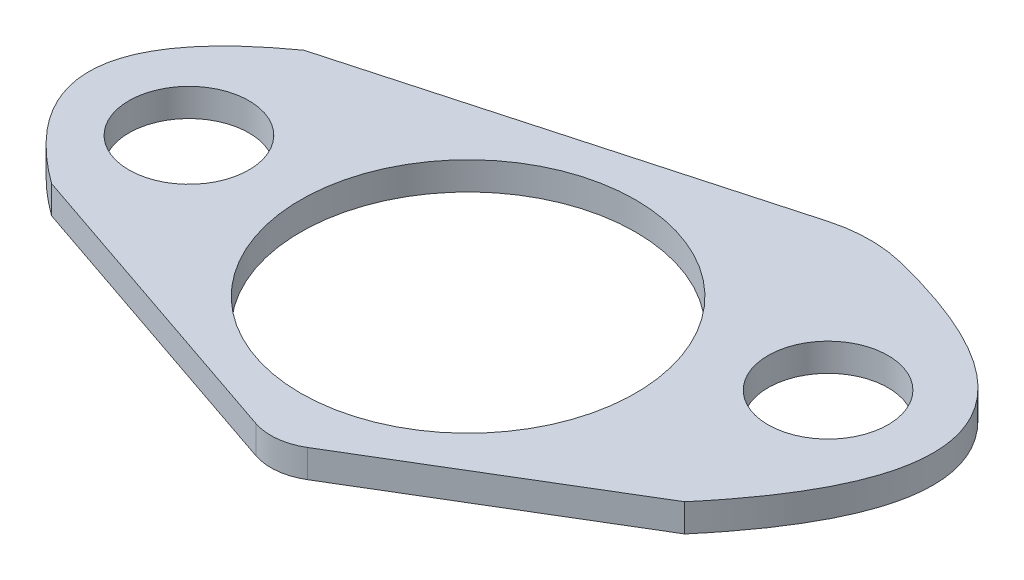
ISO-10303-21;
HEADER;
FILE_DESCRIPTION(('STEP AP214'),'2;1');
FILE_NAME('part.step','',(''),(''),'','','');
FILE_SCHEMA(('AUTOMOTIVE_DESIGN { 1 0 10303 214 1 1 1 1 }'));
ENDSEC;
DATA;
#1=APPLICATION_CONTEXT('core data for automotive mechanical design processes');
#2=APPLICATION_PROTOCOL_DEFINITION('international standard','automotive_design',2000,#1);
#3=PRODUCT_CONTEXT('',#1,'mechanical');
#4=PRODUCT('Part','Part','',(#3));
#5=PRODUCT_RELATED_PRODUCT_CATEGORY('part','',(#4));
#6=PRODUCT_DEFINITION_FORMATION('','',#4);
#7=PRODUCT_DEFINITION_CONTEXT('part definition',#1,'design');
#8=PRODUCT_DEFINITION('design','',#6,#7);
#9=PRODUCT_DEFINITION_SHAPE('','',#8);
#10=(LENGTH_UNIT() NAMED_UNIT(*) SI_UNIT(.MILLI.,.METRE.));
#11=(NAMED_UNIT(*) PLANE_ANGLE_UNIT() SI_UNIT($,.RADIAN.));
#12=(NAMED_UNIT(*) SI_UNIT($,.STERADIAN.) SOLID_ANGLE_UNIT());
#13=UNCERTAINTY_MEASURE_WITH_UNIT(LENGTH_MEASURE(1.E-05),#10,'distance_accuracy_value','');
#14=(GEOMETRIC_REPRESENTATION_CONTEXT(3) GLOBAL_UNCERTAINTY_ASSIGNED_CONTEXT((#13)) GLOBAL_UNIT_ASSIGNED_CONTEXT((#10,
#11,#12)) REPRESENTATION_CONTEXT('',''));
#15=CARTESIAN_POINT('',(0.,0.,0.));
#16=DIRECTION('',(0.,0.,1.));
#17=DIRECTION('',(1.,0.,0.));
#18=AXIS2_PLACEMENT_3D('',#15,#16,#17);
#19=CARTESIAN_POINT('',(5.45038988415731,0.,-3.95758579465904));
#20=DIRECTION('',(0.,-1.,0.));
#21=DIRECTION('',(0.,0.,-1.));
#22=AXIS2_PLACEMENT_3D('',#19,#20,#21);
#23=CYLINDRICAL_SURFACE('',#22,5.);
#24=DIRECTION('',(0.,-1.,0.));
#25=VECTOR('',#24,1.);
#26=CARTESIAN_POINT('',(6.64109145170587,0.,-8.81373959957888));
#27=LINE('',#26,#25);
#28=CARTESIAN_POINT('',(6.64109145170586,0.,-8.81373959957888));
#29=VERTEX_POINT('',#28);
#30=CARTESIAN_POINT('',(6.64109145170587,1.,-8.81373959957888));
#31=VERTEX_POINT('',#30);
#32=EDGE_CURVE('E146',#29,#31,#27,.F.);
#33=ORIENTED_EDGE('',*,*,#32,.F.);
#34=CARTESIAN_POINT('',(5.45038988415731,0.,-3.95758579465904));
#35=DIRECTION('',(0.,-1.,0.));
#36=DIRECTION('',(0.,0.,-1.));
#37=AXIS2_PLACEMENT_3D('',#34,#35,#36);
#38=CIRCLE('',#37,5.);
#39=CARTESIAN_POINT('',(4.1138367117806,0.,-8.77563785097908));
#40=VERTEX_POINT('',#39);
#41=EDGE_CURVE('E51',#40,#29,#38,.T.);
#42=ORIENTED_EDGE('',*,*,#41,.F.);
#43=DIRECTION('',(0.,-1.,0.));
#44=VECTOR('',#43,1.);
#45=CARTESIAN_POINT('',(4.11383671178059,1.,-8.77563785097908));
#46=LINE('',#45,#44);
#47=CARTESIAN_POINT('',(4.1138367117806,1.,-8.77563785097908));
#48=VERTEX_POINT('',#47);
#49=EDGE_CURVE('E150',#48,#40,#46,.T.);
#50=ORIENTED_EDGE('',*,*,#49,.F.);
#51=CARTESIAN_POINT('',(5.45038988415731,1.,-3.95758579465904));
#52=DIRECTION('',(0.,-1.,0.));
#53=DIRECTION('',(0.,0.,-1.));
#54=AXIS2_PLACEMENT_3D('',#51,#52,#53);
#55=CIRCLE('',#54,5.);
#56=EDGE_CURVE('E11',#31,#48,#55,.F.);
#57=ORIENTED_EDGE('',*,*,#56,.F.);
#58=EDGE_LOOP('',(#33,#42,#50,#57));
#59=FACE_BOUND('',#58,.T.);
#60=ADVANCED_FACE('F43',(#59),#23,.T.);
#61=CARTESIAN_POINT('',(0.777553723335326,1.,5.84503285433422));
#62=DIRECTION('',(0.,1.,0.));
#63=DIRECTION('',(0.,0.,1.));
#64=AXIS2_PLACEMENT_3D('',#61,#62,#63);
#65=CYLINDRICAL_SURFACE('',#64,2.);
#66=DIRECTION('',(0.,1.,0.));
#67=VECTOR('',#66,1.);
#68=CARTESIAN_POINT('',(0.132486894246065,1.,7.73814901189263));
#69=LINE('',#68,#67);
#70=CARTESIAN_POINT('',(0.132486894246069,0.,7.73814901189264));
#71=VERTEX_POINT('',#70);
#72=CARTESIAN_POINT('',(0.132486894246069,1.,7.73814901189264));
#73=VERTEX_POINT('',#72);
#74=EDGE_CURVE('E109',#71,#73,#69,.T.);
#75=ORIENTED_EDGE('',*,*,#74,.F.);
#76=CARTESIAN_POINT('',(0.777553723335326,0.,5.84503285433422));
#77=DIRECTION('',(0.,-1.,0.));
#78=DIRECTION('',(0.,0.,-1.));
#79=AXIS2_PLACEMENT_3D('',#76,#77,#78);
#80=CIRCLE('',#79,2.);
#81=CARTESIAN_POINT('',(1.80774731284779,0.,7.55929688537711));
#82=VERTEX_POINT('',#81);
#83=EDGE_CURVE('E140',#82,#71,#80,.T.);
#84=ORIENTED_EDGE('',*,*,#83,.F.);
#85=DIRECTION('',(0.,1.,0.));
#86=VECTOR('',#85,1.);
#87=CARTESIAN_POINT('',(1.80774731284779,1.,7.55929688537711));
#88=LINE('',#87,#86);
#89=CARTESIAN_POINT('',(1.80774731284779,1.,7.55929688537711));
#90=VERTEX_POINT('',#89);
#91=EDGE_CURVE('E130',#90,#82,#88,.F.);
#92=ORIENTED_EDGE('',*,*,#91,.F.);
#93=CARTESIAN_POINT('',(0.777553723335326,1.,5.84503285433422));
#94=DIRECTION('',(0.,-1.,0.));
#95=DIRECTION('',(0.,0.,-1.));
#96=AXIS2_PLACEMENT_3D('',#93,#94,#95);
#97=CIRCLE('',#96,2.);
#98=EDGE_CURVE('E143',#73,#90,#97,.F.);
#99=ORIENTED_EDGE('',*,*,#98,.F.);
#100=EDGE_LOOP('',(#75,#84,#92,#99));
#101=FACE_BOUND('',#100,.T.);
#102=ADVANCED_FACE('F200',(#101),#65,.T.);
#103=CARTESIAN_POINT('',(-10.5797371845221,1.,-4.69956258755513));
#104=CARTESIAN_POINT('',(-16.7656801794043,1.,-0.278506661591382));
#105=CARTESIAN_POINT('',(-10.9596759308178,1.,3.9585677787295));
#106=B_SPLINE_CURVE_WITH_KNOTS('',2,(#103,#104,#105),.UNSPECIFIED.,.F.,.F.,(3,3),(0.,1.),.UNSPECIFIED.);
#107=DIRECTION('',(0.,-1.,0.));
#108=VECTOR('',#107,1.);
#109=SURFACE_OF_LINEAR_EXTRUSION('',#106,#108);
#110=CARTESIAN_POINT('',(-10.5797371845221,0.,-4.69956258755513));
#111=CARTESIAN_POINT('',(-16.7656801794043,0.,-0.278506661591382));
#112=CARTESIAN_POINT('',(-10.9596759308178,0.,3.9585677787295));
#113=B_SPLINE_CURVE_WITH_KNOTS('',2,(#110,#111,#112),.UNSPECIFIED.,.F.,.F.,(3,3),(0.,1.),.UNSPECIFIED.);
#114=CARTESIAN_POINT('',(-10.5797371845221,0.,-4.69956258755513));
#115=VERTEX_POINT('',#114);
#116=CARTESIAN_POINT('',(-10.9596759308178,0.,3.9585677787295));
#117=VERTEX_POINT('',#116);
#118=EDGE_CURVE('E124',#115,#117,#113,.T.);
#119=ORIENTED_EDGE('',*,*,#118,.T.);
#120=DIRECTION('',(0.,-1.,0.));
#121=VECTOR('',#120,1.);
#122=CARTESIAN_POINT('',(-10.9596759308178,1.,3.9585677787295));
#123=LINE('',#122,#121);
#124=CARTESIAN_POINT('',(-10.9596759308178,1.,3.9585677787295));
#125=VERTEX_POINT('',#124);
#126=EDGE_CURVE('E106',#125,#117,#123,.T.);
#127=ORIENTED_EDGE('',*,*,#126,.F.);
#128=CARTESIAN_POINT('',(-10.5797371845221,1.,-4.69956258755513));
#129=VERTEX_POINT('',#128);
#130=EDGE_CURVE('E112',#129,#125,#106,.T.);
#131=ORIENTED_EDGE('',*,*,#130,.F.);
#132=DIRECTION('',(0.,-1.,0.));
#133=VECTOR('',#132,1.);
#134=CARTESIAN_POINT('',(-10.5797371845221,1.,-4.69956258755513));
#135=LINE('',#134,#133);
#136=EDGE_CURVE('E133',#129,#115,#135,.T.);
#137=ORIENTED_EDGE('',*,*,#136,.T.);
#138=EDGE_LOOP('',(#119,#127,#131,#137));
#139=FACE_BOUND('',#138,.T.);
#140=ADVANCED_FACE('F122',(#139),#109,.F.);
#141=CARTESIAN_POINT('',(-10.9596759308178,1.,3.9585677787295));
#142=DIRECTION('',(0.32253341454463,0.,-0.946558078779206));
#143=DIRECTION('',(-0.946558078779206,0.,-0.32253341454463));
#144=AXIS2_PLACEMENT_3D('',#141,#142,#143);
#145=PLANE('',#144);
#146=DIRECTION('',(0.946558078779206,0.,0.32253341454463));
#147=VECTOR('',#146,1.);
#148=CARTESIAN_POINT('',(-10.9596759308178,0.,3.9585677787295));
#149=LINE('',#148,#147);
#150=EDGE_CURVE('E170',#117,#71,#149,.T.);
#151=ORIENTED_EDGE('',*,*,#150,.T.);
#152=ORIENTED_EDGE('',*,*,#74,.T.);
#153=DIRECTION('',(0.946558078779206,0.,0.32253341454463));
#154=VECTOR('',#153,1.);
#155=CARTESIAN_POINT('',(-10.9596759308178,1.,3.9585677787295));
#156=LINE('',#155,#154);
#157=EDGE_CURVE('E101',#125,#73,#156,.T.);
#158=ORIENTED_EDGE('',*,*,#157,.F.);
#159=ORIENTED_EDGE('',*,*,#126,.T.);
#160=EDGE_LOOP('',(#151,#152,#158,#159));
#161=FACE_BOUND('',#160,.T.);
#162=ADVANCED_FACE('F104',(#161),#145,.F.);
#163=CARTESIAN_POINT('',(1.01164639525854,1.,8.03771680614422));
#164=DIRECTION('',(-0.515096794756232,0.,-0.857132015521446));
#165=DIRECTION('',(-0.857132015521446,0.,0.515096794756231));
#166=AXIS2_PLACEMENT_3D('',#163,#164,#165);
#167=PLANE('',#166);
#168=DIRECTION('',(0.857132015521446,0.,-0.515096794756231));
#169=VECTOR('',#168,1.);
#170=CARTESIAN_POINT('',(1.01164639525854,1.,8.03771680614422));
#171=LINE('',#170,#169);
#172=CARTESIAN_POINT('',(10.2465720826435,1.,2.48795255134611));
#173=VERTEX_POINT('',#172);
#174=EDGE_CURVE('E111',#90,#173,#171,.T.);
#175=ORIENTED_EDGE('',*,*,#174,.F.);
#176=ORIENTED_EDGE('',*,*,#91,.T.);
#177=DIRECTION('',(0.857132015521446,0.,-0.515096794756231));
#178=VECTOR('',#177,1.);
#179=CARTESIAN_POINT('',(1.01164639525854,0.,8.03771680614422));
#180=LINE('',#179,#178);
#181=CARTESIAN_POINT('',(10.2465720826435,0.,2.48795255134611));
#182=VERTEX_POINT('',#181);
#183=EDGE_CURVE('E165',#82,#182,#180,.T.);
#184=ORIENTED_EDGE('',*,*,#183,.T.);
#185=DIRECTION('',(0.,-1.,0.));
#186=VECTOR('',#185,1.);
#187=CARTESIAN_POINT('',(10.2465720826435,1.,2.48795255134611));
#188=LINE('',#187,#186);
#189=EDGE_CURVE('E126',#173,#182,#188,.T.);
#190=ORIENTED_EDGE('',*,*,#189,.F.);
#191=EDGE_LOOP('',(#175,#176,#184,#190));
#192=FACE_BOUND('',#191,.T.);
#193=ADVANCED_FACE('F205',(#192),#167,.F.);
#194=CARTESIAN_POINT('',(5.30468611620565,1.,-9.1059857863484));
#195=CARTESIAN_POINT('',(17.9934551354676,1.,-6.63776238551715));
#196=CARTESIAN_POINT('',(10.2465720826435,1.,2.48795255134611));
#197=B_SPLINE_CURVE_WITH_KNOTS('',2,(#194,#195,#196),.UNSPECIFIED.,.F.,.F.,(3,3),(0.,1.),.UNSPECIFIED.);
#198=DIRECTION('',(0.,-1.,0.));
#199=VECTOR('',#198,1.);
#200=SURFACE_OF_LINEAR_EXTRUSION('',#197,#199);
#201=CARTESIAN_POINT('',(5.30468611620565,0.,-9.1059857863484));
#202=CARTESIAN_POINT('',(17.9934551354676,0.,-6.63776238551715));
#203=CARTESIAN_POINT('',(10.2465720826435,0.,2.48795255134611));
#204=B_SPLINE_CURVE_WITH_KNOTS('',2,(#201,#202,#203),.UNSPECIFIED.,.F.,.F.,(3,3),(0.,1.),.UNSPECIFIED.);
#205=EDGE_CURVE('E158',#29,#182,#204,.T.);
#206=ORIENTED_EDGE('',*,*,#205,.F.);
#207=ORIENTED_EDGE('',*,*,#32,.T.);
#208=EDGE_CURVE('E180',#31,#173,#197,.T.);
#209=ORIENTED_EDGE('',*,*,#208,.T.);
#210=ORIENTED_EDGE('',*,*,#189,.T.);
#211=EDGE_LOOP('',(#206,#207,#209,#210));
#212=FACE_BOUND('',#211,.T.);
#213=ADVANCED_FACE('F162',(#212),#200,.T.);
#214=CARTESIAN_POINT('',(-10.5797371845221,1.,-4.69956258755513));
#215=DIRECTION('',(-0.267310634475343,0.,-0.963610411264008));
#216=DIRECTION('',(-0.963610411264008,0.,0.267310634475343));
#217=AXIS2_PLACEMENT_3D('',#214,#215,#216);
#218=PLANE('',#217);
#219=DIRECTION('',(0.963610411264008,0.,-0.267310634475343));
#220=VECTOR('',#219,1.);
#221=CARTESIAN_POINT('',(-10.5797371845221,1.,-4.69956258755513));
#222=LINE('',#221,#220);
#223=EDGE_CURVE('E117',#129,#48,#222,.T.);
#224=ORIENTED_EDGE('',*,*,#223,.T.);
#225=ORIENTED_EDGE('',*,*,#49,.T.);
#226=DIRECTION('',(0.963610411264008,0.,-0.267310634475343));
#227=VECTOR('',#226,1.);
#228=CARTESIAN_POINT('',(-10.5797371845221,0.,-4.69956258755513));
#229=LINE('',#228,#227);
#230=EDGE_CURVE('E120',#115,#40,#229,.T.);
#231=ORIENTED_EDGE('',*,*,#230,.F.);
#232=ORIENTED_EDGE('',*,*,#136,.F.);
#233=EDGE_LOOP('',(#224,#225,#231,#232));
#234=FACE_BOUND('',#233,.T.);
#235=ADVANCED_FACE('F212',(#234),#218,.T.);
#236=CARTESIAN_POINT('',(-13.7676933685371,1.,-0.324502033002098));
#237=DIRECTION('',(0.,-1.,0.));
#238=DIRECTION('',(0.,0.,-1.));
#239=AXIS2_PLACEMENT_3D('',#236,#237,#238);
#240=PLANE('',#239);
#241=CARTESIAN_POINT('',(9.35151377383885,1.,-3.54248361149383));
#242=DIRECTION('',(0.,1.,0.));
#243=DIRECTION('',(0.,0.,1.));
#244=AXIS2_PLACEMENT_3D('',#241,#242,#243);
#245=CIRCLE('',#244,2.15);
#246=CARTESIAN_POINT('',(9.35151377383885,1.,-1.39248361149383));
#247=VERTEX_POINT('',#246);
#248=EDGE_CURVE('E242',#247,#247,#245,.T.);
#249=ORIENTED_EDGE('',*,*,#248,.F.);
#250=EDGE_LOOP('',(#249));
#251=FACE_BOUND('',#250,.T.);
#252=CARTESIAN_POINT('',(-10.,1.,0.));
#253=DIRECTION('',(0.,1.,0.));
#254=DIRECTION('',(0.,0.,1.));
#255=AXIS2_PLACEMENT_3D('',#252,#253,#254);
#256=CIRCLE('',#255,2.15);
#257=CARTESIAN_POINT('',(-10.,1.,2.15));
#258=VERTEX_POINT('',#257);
#259=EDGE_CURVE('E234',#258,#258,#256,.T.);
#260=ORIENTED_EDGE('',*,*,#259,.F.);
#261=EDGE_LOOP('',(#260));
#262=FACE_BOUND('',#261,.T.);
#263=CARTESIAN_POINT('',(0.,1.,0.));
#264=DIRECTION('',(0.,1.,0.));
#265=DIRECTION('',(0.,0.,1.));
#266=AXIS2_PLACEMENT_3D('',#263,#264,#265);
#267=CIRCLE('',#266,6.);
#268=CARTESIAN_POINT('',(0.,1.,6.));
#269=VERTEX_POINT('',#268);
#270=EDGE_CURVE('E227',#269,#269,#267,.T.);
#271=ORIENTED_EDGE('',*,*,#270,.F.);
#272=EDGE_LOOP('',(#271));
#273=FACE_BOUND('',#272,.T.);
#274=ORIENTED_EDGE('',*,*,#208,.F.);
#275=ORIENTED_EDGE('',*,*,#56,.T.);
#276=ORIENTED_EDGE('',*,*,#223,.F.);
#277=ORIENTED_EDGE('',*,*,#130,.T.);
#278=ORIENTED_EDGE('',*,*,#157,.T.);
#279=ORIENTED_EDGE('',*,*,#98,.T.);
#280=ORIENTED_EDGE('',*,*,#174,.T.);
#281=EDGE_LOOP('',(#274,#275,#276,#277,#278,#279,#280));
#282=FACE_BOUND('',#281,.T.);
#283=ADVANCED_FACE('F115',(#251,#262,#273,#282),#240,.F.);
#284=CARTESIAN_POINT('',(-13.7676933685371,0.,-0.324502033002098));
#285=DIRECTION('',(0.,-1.,0.));
#286=DIRECTION('',(0.,0.,-1.));
#287=AXIS2_PLACEMENT_3D('',#284,#285,#286);
#288=PLANE('',#287);
#289=CARTESIAN_POINT('',(9.35151377383885,0.,-3.54248361149383));
#290=DIRECTION('',(0.,1.,0.));
#291=DIRECTION('',(0.,0.,1.));
#292=AXIS2_PLACEMENT_3D('',#289,#290,#291);
#293=CIRCLE('',#292,2.15);
#294=CARTESIAN_POINT('',(9.35151377383885,0.,-1.39248361149383));
#295=VERTEX_POINT('',#294);
#296=EDGE_CURVE('E238',#295,#295,#293,.T.);
#297=ORIENTED_EDGE('',*,*,#296,.T.);
#298=EDGE_LOOP('',(#297));
#299=FACE_BOUND('',#298,.T.);
#300=CARTESIAN_POINT('',(-10.,0.,0.));
#301=DIRECTION('',(0.,1.,0.));
#302=DIRECTION('',(0.,0.,1.));
#303=AXIS2_PLACEMENT_3D('',#300,#301,#302);
#304=CIRCLE('',#303,2.15);
#305=CARTESIAN_POINT('',(-10.,0.,2.15));
#306=VERTEX_POINT('',#305);
#307=EDGE_CURVE('E246',#306,#306,#304,.T.);
#308=ORIENTED_EDGE('',*,*,#307,.T.);
#309=EDGE_LOOP('',(#308));
#310=FACE_BOUND('',#309,.T.);
#311=CARTESIAN_POINT('',(0.,0.,0.));
#312=DIRECTION('',(0.,1.,0.));
#313=DIRECTION('',(0.,0.,1.));
#314=AXIS2_PLACEMENT_3D('',#311,#312,#313);
#315=CIRCLE('',#314,6.);
#316=CARTESIAN_POINT('',(0.,0.,6.));
#317=VERTEX_POINT('',#316);
#318=EDGE_CURVE('E193',#317,#317,#315,.T.);
#319=ORIENTED_EDGE('',*,*,#318,.T.);
#320=EDGE_LOOP('',(#319));
#321=FACE_BOUND('',#320,.T.);
#322=ORIENTED_EDGE('',*,*,#230,.T.);
#323=ORIENTED_EDGE('',*,*,#41,.T.);
#324=ORIENTED_EDGE('',*,*,#205,.T.);
#325=ORIENTED_EDGE('',*,*,#183,.F.);
#326=ORIENTED_EDGE('',*,*,#83,.T.);
#327=ORIENTED_EDGE('',*,*,#150,.F.);
#328=ORIENTED_EDGE('',*,*,#118,.F.);
#329=EDGE_LOOP('',(#322,#323,#324,#325,#326,#327,#328));
#330=FACE_BOUND('',#329,.T.);
#331=ADVANCED_FACE('F155',(#299,#310,#321,#330),#288,.T.);
#332=CARTESIAN_POINT('',(0.,0.,0.));
#333=DIRECTION('',(0.,1.,0.));
#334=DIRECTION('',(0.,0.,1.));
#335=AXIS2_PLACEMENT_3D('',#332,#333,#334);
#336=CYLINDRICAL_SURFACE('',#335,6.);
#337=ORIENTED_EDGE('',*,*,#318,.F.);
#338=EDGE_LOOP('',(#337));
#339=FACE_BOUND('',#338,.T.);
#340=ORIENTED_EDGE('',*,*,#270,.T.);
#341=EDGE_LOOP('',(#340));
#342=FACE_BOUND('',#341,.T.);
#343=ADVANCED_FACE('F262',(#339,#342),#336,.F.);
#344=CARTESIAN_POINT('',(-10.,0.,0.));
#345=DIRECTION('',(0.,1.,0.));
#346=DIRECTION('',(0.,0.,1.));
#347=AXIS2_PLACEMENT_3D('',#344,#345,#346);
#348=CYLINDRICAL_SURFACE('',#347,2.15);
#349=ORIENTED_EDGE('',*,*,#307,.F.);
#350=EDGE_LOOP('',(#349));
#351=FACE_BOUND('',#350,.T.);
#352=ORIENTED_EDGE('',*,*,#259,.T.);
#353=EDGE_LOOP('',(#352));
#354=FACE_BOUND('',#353,.T.);
#355=ADVANCED_FACE('F254',(#351,#354),#348,.F.);
#356=CARTESIAN_POINT('',(9.35151377383885,0.,-3.54248361149383));
#357=DIRECTION('',(0.,1.,0.));
#358=DIRECTION('',(0.,0.,1.));
#359=AXIS2_PLACEMENT_3D('',#356,#357,#358);
#360=CYLINDRICAL_SURFACE('',#359,2.15);
#361=ORIENTED_EDGE('',*,*,#296,.F.);
#362=EDGE_LOOP('',(#361));
#363=FACE_BOUND('',#362,.T.);
#364=ORIENTED_EDGE('',*,*,#248,.T.);
#365=EDGE_LOOP('',(#364));
#366=FACE_BOUND('',#365,.T.);
#367=ADVANCED_FACE('F270',(#363,#366),#360,.F.);
#368=CLOSED_SHELL('',(#60,#102,#140,#162,#193,#213,#235,#283,#331,#343,#355,#367));
#369=MANIFOLD_SOLID_BREP('B2',#368);
#370=ADVANCED_BREP_SHAPE_REPRESENTATION('',(#18,#369),#14);
#371=SHAPE_DEFINITION_REPRESENTATION(#9,#370);
ENDSEC;
END-ISO-10303-21;
